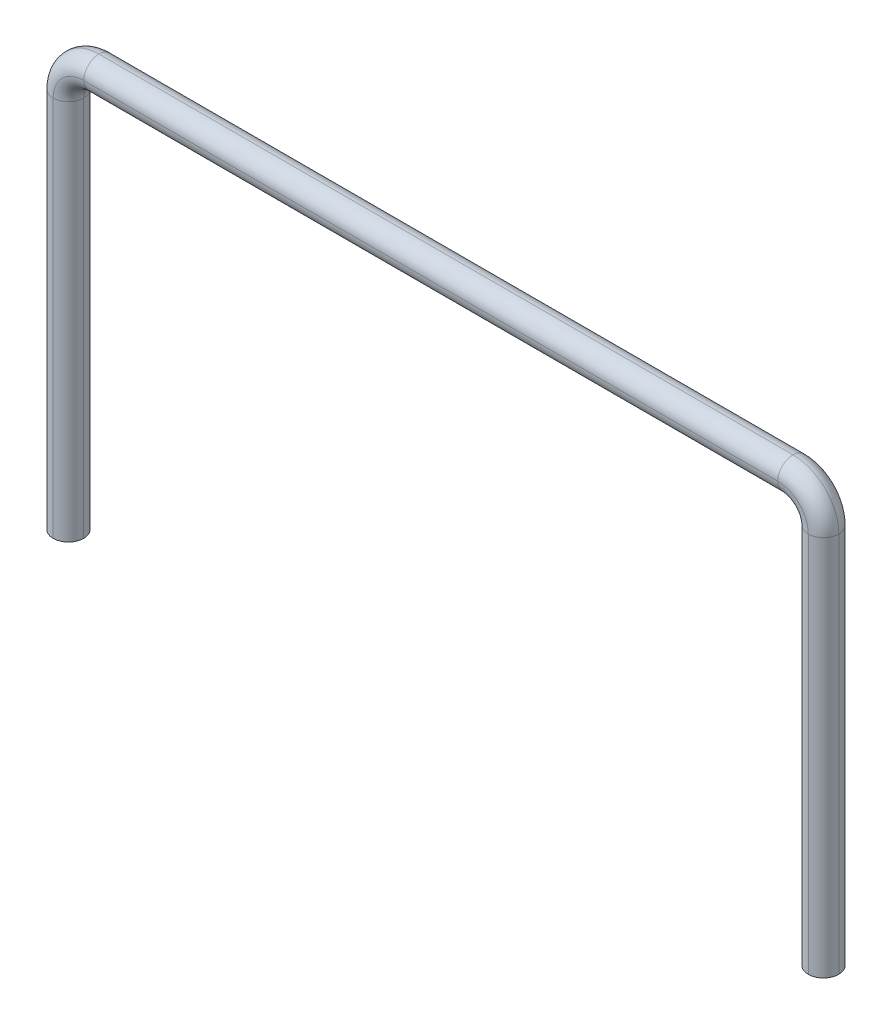
ISO-10303-21;
HEADER;
FILE_DESCRIPTION(('STEP AP214'),'2;1');
FILE_NAME('part.step','',(''),(''),'','','');
FILE_SCHEMA(('AUTOMOTIVE_DESIGN { 1 0 10303 214 1 1 1 1 }'));
ENDSEC;
DATA;
#1=APPLICATION_CONTEXT('core data for automotive mechanical design processes');
#2=APPLICATION_PROTOCOL_DEFINITION('international standard','automotive_design',2000,#1);
#3=PRODUCT_CONTEXT('',#1,'mechanical');
#4=PRODUCT('Part','Part','',(#3));
#5=PRODUCT_RELATED_PRODUCT_CATEGORY('part','',(#4));
#6=PRODUCT_DEFINITION_FORMATION('','',#4);
#7=PRODUCT_DEFINITION_CONTEXT('part definition',#1,'design');
#8=PRODUCT_DEFINITION('design','',#6,#7);
#9=PRODUCT_DEFINITION_SHAPE('','',#8);
#10=(LENGTH_UNIT() NAMED_UNIT(*) SI_UNIT(.MILLI.,.METRE.));
#11=(NAMED_UNIT(*) PLANE_ANGLE_UNIT() SI_UNIT($,.RADIAN.));
#12=(NAMED_UNIT(*) SI_UNIT($,.STERADIAN.) SOLID_ANGLE_UNIT());
#13=UNCERTAINTY_MEASURE_WITH_UNIT(LENGTH_MEASURE(1.E-05),#10,'distance_accuracy_value','');
#14=(GEOMETRIC_REPRESENTATION_CONTEXT(3) GLOBAL_UNCERTAINTY_ASSIGNED_CONTEXT((#13)) GLOBAL_UNIT_ASSIGNED_CONTEXT((#10,
#11,#12)) REPRESENTATION_CONTEXT('',''));
#15=CARTESIAN_POINT('',(0.,0.,0.));
#16=DIRECTION('',(0.,0.,1.));
#17=DIRECTION('',(1.,0.,0.));
#18=AXIS2_PLACEMENT_3D('',#15,#16,#17);
#19=CARTESIAN_POINT('',(25.75,0.,2.));
#20=DIRECTION('',(0.,-1.,0.));
#21=DIRECTION('',(0.,0.,-0.999999999999999));
#22=AXIS2_PLACEMENT_3D('',#19,#20,#21);
#23=PLANE('',#22);
#24=CARTESIAN_POINT('',(24.75,0.,1.00000000000017));
#25=DIRECTION('',(0.,-1.,0.));
#26=DIRECTION('',(0.,0.,-0.999999999999999));
#27=AXIS2_PLACEMENT_3D('',#24,#25,#26);
#28=CIRCLE('',#27,1.);
#29=CARTESIAN_POINT('',(23.75,0.,1.00000000000017));
#30=VERTEX_POINT('',#29);
#31=CARTESIAN_POINT('',(24.75,0.,1.66533453693773E-13));
#32=VERTEX_POINT('',#31);
#33=EDGE_CURVE('E239',#30,#32,#28,.T.);
#34=ORIENTED_EDGE('',*,*,#33,.T.);
#35=CARTESIAN_POINT('',(24.75,0.,1.00000000000017));
#36=DIRECTION('',(0.,-1.,0.));
#37=DIRECTION('',(0.,0.,-0.999999999999999));
#38=AXIS2_PLACEMENT_3D('',#35,#36,#37);
#39=CIRCLE('',#38,1.);
#40=CARTESIAN_POINT('',(25.75,0.,1.));
#41=VERTEX_POINT('',#40);
#42=EDGE_CURVE('E152',#32,#41,#39,.T.);
#43=ORIENTED_EDGE('',*,*,#42,.T.);
#44=CARTESIAN_POINT('',(24.75,0.,1.00000000000017));
#45=DIRECTION('',(0.,-1.,0.));
#46=DIRECTION('',(0.,0.,-0.999999999999999));
#47=AXIS2_PLACEMENT_3D('',#44,#45,#46);
#48=CIRCLE('',#47,1.);
#49=CARTESIAN_POINT('',(24.75,0.,2.00000000000017));
#50=VERTEX_POINT('',#49);
#51=EDGE_CURVE('E237',#41,#50,#48,.T.);
#52=ORIENTED_EDGE('',*,*,#51,.T.);
#53=CARTESIAN_POINT('',(24.75,0.,1.00000000000017));
#54=DIRECTION('',(0.,-1.,0.));
#55=DIRECTION('',(0.,0.,-0.999999999999999));
#56=AXIS2_PLACEMENT_3D('',#53,#54,#55);
#57=CIRCLE('',#56,1.);
#58=EDGE_CURVE('E235',#50,#30,#57,.T.);
#59=ORIENTED_EDGE('',*,*,#58,.T.);
#60=EDGE_LOOP('',(#34,#43,#52,#59));
#61=FACE_BOUND('',#60,.T.);
#62=ADVANCED_FACE('F28',(#61),#23,.T.);
#63=CARTESIAN_POINT('',(-23.75,0.,2.));
#64=DIRECTION('',(0.,-1.,0.));
#65=DIRECTION('',(0.,0.,-0.999999999999999));
#66=AXIS2_PLACEMENT_3D('',#63,#64,#65);
#67=PLANE('',#66);
#68=CARTESIAN_POINT('',(-24.75,0.,1.));
#69=DIRECTION('',(0.,-1.,0.));
#70=DIRECTION('',(0.,0.,-0.999999999999999));
#71=AXIS2_PLACEMENT_3D('',#68,#69,#70);
#72=CIRCLE('',#71,1.);
#73=CARTESIAN_POINT('',(-24.75,0.,2.));
#74=VERTEX_POINT('',#73);
#75=CARTESIAN_POINT('',(-25.75,0.,1.));
#76=VERTEX_POINT('',#75);
#77=EDGE_CURVE('E41',#74,#76,#72,.T.);
#78=ORIENTED_EDGE('',*,*,#77,.T.);
#79=CARTESIAN_POINT('',(-24.75,0.,1.));
#80=DIRECTION('',(0.,-1.,0.));
#81=DIRECTION('',(0.,0.,-0.999999999999999));
#82=AXIS2_PLACEMENT_3D('',#79,#80,#81);
#83=CIRCLE('',#82,1.);
#84=CARTESIAN_POINT('',(-24.75,0.,0.));
#85=VERTEX_POINT('',#84);
#86=EDGE_CURVE('E11',#76,#85,#83,.T.);
#87=ORIENTED_EDGE('',*,*,#86,.T.);
#88=CARTESIAN_POINT('',(-24.75,0.,1.));
#89=DIRECTION('',(0.,-1.,0.));
#90=DIRECTION('',(0.,0.,-0.999999999999999));
#91=AXIS2_PLACEMENT_3D('',#88,#89,#90);
#92=CIRCLE('',#91,1.);
#93=CARTESIAN_POINT('',(-23.75,0.,1.00000000000017));
#94=VERTEX_POINT('',#93);
#95=EDGE_CURVE('E35',#85,#94,#92,.T.);
#96=ORIENTED_EDGE('',*,*,#95,.T.);
#97=CARTESIAN_POINT('',(-24.75,0.,1.));
#98=DIRECTION('',(0.,-1.,0.));
#99=DIRECTION('',(0.,0.,-0.999999999999999));
#100=AXIS2_PLACEMENT_3D('',#97,#98,#99);
#101=CIRCLE('',#100,1.);
#102=EDGE_CURVE('E46',#94,#74,#101,.T.);
#103=ORIENTED_EDGE('',*,*,#102,.T.);
#104=EDGE_LOOP('',(#78,#87,#96,#103));
#105=FACE_BOUND('',#104,.T.);
#106=ADVANCED_FACE('F244',(#105),#67,.T.);
#107=CARTESIAN_POINT('',(-24.75,25.,1.));
#108=DIRECTION('',(0.,1.,0.));
#109=DIRECTION('',(0.,0.,0.999999999999999));
#110=AXIS2_PLACEMENT_3D('',#107,#108,#109);
#111=CYLINDRICAL_SURFACE('',#110,1.);
#112=DIRECTION('',(0.,1.,0.));
#113=VECTOR('',#112,1.);
#114=CARTESIAN_POINT('',(-24.75,25.,2.));
#115=LINE('',#114,#113);
#116=CARTESIAN_POINT('',(-24.75,25.,2.));
#117=VERTEX_POINT('',#116);
#118=EDGE_CURVE('E233',#74,#117,#115,.T.);
#119=ORIENTED_EDGE('',*,*,#118,.F.);
#120=ORIENTED_EDGE('',*,*,#102,.F.);
#121=DIRECTION('',(0.,1.,0.));
#122=VECTOR('',#121,1.);
#123=CARTESIAN_POINT('',(-23.75,0.,1.00000000000017));
#124=LINE('',#123,#122);
#125=CARTESIAN_POINT('',(-23.75,25.,1.00000000000017));
#126=VERTEX_POINT('',#125);
#127=EDGE_CURVE('E230',#126,#94,#124,.F.);
#128=ORIENTED_EDGE('',*,*,#127,.F.);
#129=CARTESIAN_POINT('',(-24.75,25.,1.));
#130=DIRECTION('',(0.,1.,0.));
#131=DIRECTION('',(0.,0.,0.999999999999999));
#132=AXIS2_PLACEMENT_3D('',#129,#130,#131);
#133=CIRCLE('',#132,1.);
#134=EDGE_CURVE('E227',#117,#126,#133,.T.);
#135=ORIENTED_EDGE('',*,*,#134,.F.);
#136=EDGE_LOOP('',(#119,#120,#128,#135));
#137=FACE_BOUND('',#136,.T.);
#138=ADVANCED_FACE('F248',(#137),#111,.T.);
#139=CARTESIAN_POINT('',(-24.75,0.,1.));
#140=DIRECTION('',(0.,-1.,0.));
#141=DIRECTION('',(0.,0.,-0.999999999999999));
#142=AXIS2_PLACEMENT_3D('',#139,#140,#141);
#143=CYLINDRICAL_SURFACE('',#142,1.);
#144=ORIENTED_EDGE('',*,*,#77,.F.);
#145=ORIENTED_EDGE('',*,*,#118,.T.);
#146=CARTESIAN_POINT('',(-24.75,25.,1.));
#147=DIRECTION('',(0.,1.,0.));
#148=DIRECTION('',(0.,0.,0.999999999999999));
#149=AXIS2_PLACEMENT_3D('',#146,#147,#148);
#150=CIRCLE('',#149,1.);
#151=CARTESIAN_POINT('',(-25.75,25.,1.));
#152=VERTEX_POINT('',#151);
#153=EDGE_CURVE('E222',#152,#117,#150,.T.);
#154=ORIENTED_EDGE('',*,*,#153,.F.);
#155=DIRECTION('',(0.,1.,0.));
#156=VECTOR('',#155,1.);
#157=CARTESIAN_POINT('',(-25.75,25.,1.));
#158=LINE('',#157,#156);
#159=EDGE_CURVE('E219',#76,#152,#158,.T.);
#160=ORIENTED_EDGE('',*,*,#159,.F.);
#161=EDGE_LOOP('',(#144,#145,#154,#160));
#162=FACE_BOUND('',#161,.T.);
#163=ADVANCED_FACE('F277',(#162),#143,.T.);
#164=CARTESIAN_POINT('',(-24.75,0.,1.));
#165=DIRECTION('',(0.,-1.,0.));
#166=DIRECTION('',(0.,0.,-0.999999999999999));
#167=AXIS2_PLACEMENT_3D('',#164,#165,#166);
#168=CYLINDRICAL_SURFACE('',#167,1.);
#169=ORIENTED_EDGE('',*,*,#127,.T.);
#170=ORIENTED_EDGE('',*,*,#95,.F.);
#171=DIRECTION('',(0.,1.,0.));
#172=VECTOR('',#171,1.);
#173=CARTESIAN_POINT('',(-24.75,0.,0.));
#174=LINE('',#173,#172);
#175=CARTESIAN_POINT('',(-24.75,25.,0.));
#176=VERTEX_POINT('',#175);
#177=EDGE_CURVE('E217',#176,#85,#174,.F.);
#178=ORIENTED_EDGE('',*,*,#177,.F.);
#179=CARTESIAN_POINT('',(-24.75,25.,1.));
#180=DIRECTION('',(0.,1.,0.));
#181=DIRECTION('',(0.,0.,0.999999999999999));
#182=AXIS2_PLACEMENT_3D('',#179,#180,#181);
#183=CIRCLE('',#182,1.);
#184=EDGE_CURVE('E214',#126,#176,#183,.T.);
#185=ORIENTED_EDGE('',*,*,#184,.F.);
#186=EDGE_LOOP('',(#169,#170,#178,#185));
#187=FACE_BOUND('',#186,.T.);
#188=ADVANCED_FACE('F251',(#187),#168,.T.);
#189=CARTESIAN_POINT('',(-22.7499999999999,25.,1.00000000000017));
#190=DIRECTION('',(0.,0.,-0.999999999999999));
#191=DIRECTION('',(-0.999999999999999,0.,0.));
#192=AXIS2_PLACEMENT_3D('',#189,#190,#191);
#193=TOROIDAL_SURFACE('',#192,2.,1.);
#194=CARTESIAN_POINT('',(-22.75,25.,2.));
#195=DIRECTION('',(0.,0.,-0.999999999999999));
#196=DIRECTION('',(-0.999999999999999,0.,0.));
#197=AXIS2_PLACEMENT_3D('',#194,#195,#196);
#198=CIRCLE('',#197,2.);
#199=CARTESIAN_POINT('',(-22.75,27.,2.));
#200=VERTEX_POINT('',#199);
#201=EDGE_CURVE('E225',#117,#200,#198,.T.);
#202=ORIENTED_EDGE('',*,*,#201,.F.);
#203=ORIENTED_EDGE('',*,*,#134,.T.);
#204=CARTESIAN_POINT('',(-22.7499999999999,25.,1.00000000000017));
#205=DIRECTION('',(0.,0.,-0.999999999999999));
#206=DIRECTION('',(-0.999999999999999,0.,0.));
#207=AXIS2_PLACEMENT_3D('',#204,#205,#206);
#208=CIRCLE('',#207,1.);
#209=CARTESIAN_POINT('',(-22.7499999999999,26.,1.00000000000017));
#210=VERTEX_POINT('',#209);
#211=EDGE_CURVE('E211',#210,#126,#208,.F.);
#212=ORIENTED_EDGE('',*,*,#211,.F.);
#213=CARTESIAN_POINT('',(-22.7499999999999,27.,1.00000000000017));
#214=DIRECTION('',(0.999999999999999,0.,0.));
#215=DIRECTION('',(0.,0.,-0.999999999999999));
#216=AXIS2_PLACEMENT_3D('',#213,#214,#215);
#217=CIRCLE('',#216,1.);
#218=EDGE_CURVE('E208',#200,#210,#217,.T.);
#219=ORIENTED_EDGE('',*,*,#218,.F.);
#220=EDGE_LOOP('',(#202,#203,#212,#219));
#221=FACE_BOUND('',#220,.T.);
#222=ADVANCED_FACE('F259',(#221),#193,.T.);
#223=CARTESIAN_POINT('',(-22.7499999999999,25.,1.00000000000017));
#224=DIRECTION('',(0.,0.,-0.999999999999999));
#225=DIRECTION('',(-0.999999999999999,0.,0.));
#226=AXIS2_PLACEMENT_3D('',#223,#224,#225);
#227=TOROIDAL_SURFACE('',#226,2.,1.);
#228=ORIENTED_EDGE('',*,*,#153,.T.);
#229=ORIENTED_EDGE('',*,*,#201,.T.);
#230=CARTESIAN_POINT('',(-22.7499999999999,27.,1.00000000000017));
#231=DIRECTION('',(0.999999999999999,0.,0.));
#232=DIRECTION('',(0.,0.,-0.999999999999999));
#233=AXIS2_PLACEMENT_3D('',#230,#231,#232);
#234=CIRCLE('',#233,1.);
#235=CARTESIAN_POINT('',(-22.7499999999999,28.,1.00000000000017));
#236=VERTEX_POINT('',#235);
#237=EDGE_CURVE('E203',#236,#200,#234,.T.);
#238=ORIENTED_EDGE('',*,*,#237,.F.);
#239=CARTESIAN_POINT('',(-22.7499999999999,25.,1.00000000000017));
#240=DIRECTION('',(0.,0.,-0.999999999999999));
#241=DIRECTION('',(-0.999999999999999,0.,0.));
#242=AXIS2_PLACEMENT_3D('',#239,#240,#241);
#243=CIRCLE('',#242,3.);
#244=EDGE_CURVE('E200',#152,#236,#243,.T.);
#245=ORIENTED_EDGE('',*,*,#244,.F.);
#246=EDGE_LOOP('',(#228,#229,#238,#245));
#247=FACE_BOUND('',#246,.T.);
#248=ADVANCED_FACE('F270',(#247),#227,.T.);
#249=CARTESIAN_POINT('',(-24.75,25.,1.));
#250=DIRECTION('',(0.,1.,0.));
#251=DIRECTION('',(0.,0.,0.999999999999999));
#252=AXIS2_PLACEMENT_3D('',#249,#250,#251);
#253=CYLINDRICAL_SURFACE('',#252,1.);
#254=ORIENTED_EDGE('',*,*,#86,.F.);
#255=ORIENTED_EDGE('',*,*,#159,.T.);
#256=CARTESIAN_POINT('',(-24.75,25.,1.));
#257=DIRECTION('',(0.,1.,0.));
#258=DIRECTION('',(0.,0.,0.999999999999999));
#259=AXIS2_PLACEMENT_3D('',#256,#257,#258);
#260=CIRCLE('',#259,1.);
#261=EDGE_CURVE('E197',#176,#152,#260,.T.);
#262=ORIENTED_EDGE('',*,*,#261,.F.);
#263=ORIENTED_EDGE('',*,*,#177,.T.);
#264=EDGE_LOOP('',(#254,#255,#262,#263));
#265=FACE_BOUND('',#264,.T.);
#266=ADVANCED_FACE('F275',(#265),#253,.T.);
#267=CARTESIAN_POINT('',(-22.7499999999999,25.,1.00000000000017));
#268=DIRECTION('',(0.,0.,-0.999999999999999));
#269=DIRECTION('',(-0.999999999999999,0.,0.));
#270=AXIS2_PLACEMENT_3D('',#267,#268,#269);
#271=TOROIDAL_SURFACE('',#270,2.,1.);
#272=ORIENTED_EDGE('',*,*,#211,.T.);
#273=ORIENTED_EDGE('',*,*,#184,.T.);
#274=CARTESIAN_POINT('',(-22.75,25.,0.));
#275=DIRECTION('',(0.,0.,-0.999999999999999));
#276=DIRECTION('',(-0.999999999999999,0.,0.));
#277=AXIS2_PLACEMENT_3D('',#274,#275,#276);
#278=CIRCLE('',#277,2.);
#279=CARTESIAN_POINT('',(-22.75,27.,0.));
#280=VERTEX_POINT('',#279);
#281=EDGE_CURVE('E194',#280,#176,#278,.F.);
#282=ORIENTED_EDGE('',*,*,#281,.F.);
#283=CARTESIAN_POINT('',(-22.7499999999999,27.,1.00000000000017));
#284=DIRECTION('',(0.999999999999999,0.,0.));
#285=DIRECTION('',(0.,0.,-0.999999999999999));
#286=AXIS2_PLACEMENT_3D('',#283,#284,#285);
#287=CIRCLE('',#286,1.);
#288=EDGE_CURVE('E191',#210,#280,#287,.T.);
#289=ORIENTED_EDGE('',*,*,#288,.F.);
#290=EDGE_LOOP('',(#272,#273,#282,#289));
#291=FACE_BOUND('',#290,.T.);
#292=ADVANCED_FACE('F255',(#291),#271,.T.);
#293=CARTESIAN_POINT('',(22.75,27.,1.00000000000017));
#294=DIRECTION('',(0.999999999999999,0.,0.));
#295=DIRECTION('',(0.,0.,-0.999999999999999));
#296=AXIS2_PLACEMENT_3D('',#293,#294,#295);
#297=CYLINDRICAL_SURFACE('',#296,1.);
#298=DIRECTION('',(0.999999999999999,0.,0.));
#299=VECTOR('',#298,1.);
#300=CARTESIAN_POINT('',(22.7500000000001,27.,2.));
#301=LINE('',#300,#299);
#302=CARTESIAN_POINT('',(22.7500000000001,27.,2.));
#303=VERTEX_POINT('',#302);
#304=EDGE_CURVE('E206',#200,#303,#301,.T.);
#305=ORIENTED_EDGE('',*,*,#304,.F.);
#306=ORIENTED_EDGE('',*,*,#218,.T.);
#307=DIRECTION('',(0.999999999999999,0.,0.));
#308=VECTOR('',#307,1.);
#309=CARTESIAN_POINT('',(-22.7499999999999,26.,1.00000000000017));
#310=LINE('',#309,#308);
#311=CARTESIAN_POINT('',(22.75,26.,1.00000000000017));
#312=VERTEX_POINT('',#311);
#313=EDGE_CURVE('E188',#312,#210,#310,.F.);
#314=ORIENTED_EDGE('',*,*,#313,.F.);
#315=CARTESIAN_POINT('',(22.75,27.,1.00000000000017));
#316=DIRECTION('',(0.999999999999999,0.,0.));
#317=DIRECTION('',(0.,0.,-0.999999999999999));
#318=AXIS2_PLACEMENT_3D('',#315,#316,#317);
#319=CIRCLE('',#318,1.);
#320=EDGE_CURVE('E185',#303,#312,#319,.T.);
#321=ORIENTED_EDGE('',*,*,#320,.F.);
#322=EDGE_LOOP('',(#305,#306,#314,#321));
#323=FACE_BOUND('',#322,.T.);
#324=ADVANCED_FACE('F262',(#323),#297,.T.);
#325=CARTESIAN_POINT('',(-22.7499999999999,27.,1.00000000000017));
#326=DIRECTION('',(-0.999999999999999,0.,0.));
#327=DIRECTION('',(0.,0.,0.999999999999999));
#328=AXIS2_PLACEMENT_3D('',#325,#326,#327);
#329=CYLINDRICAL_SURFACE('',#328,1.);
#330=ORIENTED_EDGE('',*,*,#237,.T.);
#331=ORIENTED_EDGE('',*,*,#304,.T.);
#332=CARTESIAN_POINT('',(22.75,27.,1.00000000000017));
#333=DIRECTION('',(0.999999999999999,0.,0.));
#334=DIRECTION('',(0.,0.,-0.999999999999999));
#335=AXIS2_PLACEMENT_3D('',#332,#333,#334);
#336=CIRCLE('',#335,1.);
#337=CARTESIAN_POINT('',(22.75,28.,1.00000000000017));
#338=VERTEX_POINT('',#337);
#339=EDGE_CURVE('E180',#338,#303,#336,.T.);
#340=ORIENTED_EDGE('',*,*,#339,.F.);
#341=DIRECTION('',(0.999999999999999,0.,0.));
#342=VECTOR('',#341,1.);
#343=CARTESIAN_POINT('',(22.75,28.,1.00000000000017));
#344=LINE('',#343,#342);
#345=EDGE_CURVE('E177',#236,#338,#344,.T.);
#346=ORIENTED_EDGE('',*,*,#345,.F.);
#347=EDGE_LOOP('',(#330,#331,#340,#346));
#348=FACE_BOUND('',#347,.T.);
#349=ADVANCED_FACE('F267',(#348),#329,.T.);
#350=CARTESIAN_POINT('',(-22.7499999999999,25.,1.00000000000017));
#351=DIRECTION('',(0.,0.,-0.999999999999999));
#352=DIRECTION('',(-0.999999999999999,0.,0.));
#353=AXIS2_PLACEMENT_3D('',#350,#351,#352);
#354=TOROIDAL_SURFACE('',#353,2.,1.);
#355=ORIENTED_EDGE('',*,*,#261,.T.);
#356=ORIENTED_EDGE('',*,*,#244,.T.);
#357=CARTESIAN_POINT('',(-22.7499999999999,27.,1.00000000000017));
#358=DIRECTION('',(0.999999999999999,0.,0.));
#359=DIRECTION('',(0.,0.,-0.999999999999999));
#360=AXIS2_PLACEMENT_3D('',#357,#358,#359);
#361=CIRCLE('',#360,1.);
#362=EDGE_CURVE('E174',#280,#236,#361,.T.);
#363=ORIENTED_EDGE('',*,*,#362,.F.);
#364=ORIENTED_EDGE('',*,*,#281,.T.);
#365=EDGE_LOOP('',(#355,#356,#363,#364));
#366=FACE_BOUND('',#365,.T.);
#367=ADVANCED_FACE('F273',(#366),#354,.T.);
#368=CARTESIAN_POINT('',(-22.7499999999999,27.,1.00000000000017));
#369=DIRECTION('',(-0.999999999999999,0.,0.));
#370=DIRECTION('',(0.,0.,0.999999999999999));
#371=AXIS2_PLACEMENT_3D('',#368,#369,#370);
#372=CYLINDRICAL_SURFACE('',#371,1.);
#373=ORIENTED_EDGE('',*,*,#313,.T.);
#374=ORIENTED_EDGE('',*,*,#288,.T.);
#375=DIRECTION('',(0.999999999999999,0.,0.));
#376=VECTOR('',#375,1.);
#377=CARTESIAN_POINT('',(-22.75,27.,0.));
#378=LINE('',#377,#376);
#379=CARTESIAN_POINT('',(22.7500000000001,27.,0.));
#380=VERTEX_POINT('',#379);
#381=EDGE_CURVE('E171',#380,#280,#378,.F.);
#382=ORIENTED_EDGE('',*,*,#381,.F.);
#383=CARTESIAN_POINT('',(22.75,27.,1.00000000000017));
#384=DIRECTION('',(0.999999999999999,0.,0.));
#385=DIRECTION('',(0.,0.,-0.999999999999999));
#386=AXIS2_PLACEMENT_3D('',#383,#384,#385);
#387=CIRCLE('',#386,1.);
#388=EDGE_CURVE('E123',#312,#380,#387,.T.);
#389=ORIENTED_EDGE('',*,*,#388,.F.);
#390=EDGE_LOOP('',(#373,#374,#382,#389));
#391=FACE_BOUND('',#390,.T.);
#392=ADVANCED_FACE('F300',(#391),#372,.T.);
#393=CARTESIAN_POINT('',(22.75,25.,1.00000000000017));
#394=DIRECTION('',(0.,0.,-0.999999999999999));
#395=DIRECTION('',(-0.999999999999999,0.,0.));
#396=AXIS2_PLACEMENT_3D('',#393,#394,#395);
#397=TOROIDAL_SURFACE('',#396,2.,1.);
#398=CARTESIAN_POINT('',(22.7500000000001,25.,2.));
#399=DIRECTION('',(0.,0.,-0.999999999999999));
#400=DIRECTION('',(-0.999999999999999,0.,0.));
#401=AXIS2_PLACEMENT_3D('',#398,#399,#400);
#402=CIRCLE('',#401,2.);
#403=CARTESIAN_POINT('',(24.75,25.,2.00000000000017));
#404=VERTEX_POINT('',#403);
#405=EDGE_CURVE('E183',#303,#404,#402,.T.);
#406=ORIENTED_EDGE('',*,*,#405,.F.);
#407=ORIENTED_EDGE('',*,*,#320,.T.);
#408=CARTESIAN_POINT('',(22.75,25.,1.00000000000017));
#409=DIRECTION('',(0.,0.,-0.999999999999999));
#410=DIRECTION('',(-0.999999999999999,0.,0.));
#411=AXIS2_PLACEMENT_3D('',#408,#409,#410);
#412=CIRCLE('',#411,1.);
#413=CARTESIAN_POINT('',(23.75,25.,1.00000000000017));
#414=VERTEX_POINT('',#413);
#415=EDGE_CURVE('E168',#414,#312,#412,.F.);
#416=ORIENTED_EDGE('',*,*,#415,.F.);
#417=CARTESIAN_POINT('',(24.75,25.,1.00000000000017));
#418=DIRECTION('',(0.,-1.,0.));
#419=DIRECTION('',(0.,0.,-0.999999999999999));
#420=AXIS2_PLACEMENT_3D('',#417,#418,#419);
#421=CIRCLE('',#420,1.);
#422=EDGE_CURVE('E165',#404,#414,#421,.T.);
#423=ORIENTED_EDGE('',*,*,#422,.F.);
#424=EDGE_LOOP('',(#406,#407,#416,#423));
#425=FACE_BOUND('',#424,.T.);
#426=ADVANCED_FACE('F298',(#425),#397,.T.);
#427=CARTESIAN_POINT('',(22.75,25.,1.00000000000017));
#428=DIRECTION('',(0.,0.,-0.999999999999999));
#429=DIRECTION('',(-0.999999999999999,0.,0.));
#430=AXIS2_PLACEMENT_3D('',#427,#428,#429);
#431=TOROIDAL_SURFACE('',#430,2.,1.);
#432=ORIENTED_EDGE('',*,*,#339,.T.);
#433=ORIENTED_EDGE('',*,*,#405,.T.);
#434=CARTESIAN_POINT('',(24.75,25.,1.00000000000017));
#435=DIRECTION('',(0.,-1.,0.));
#436=DIRECTION('',(0.,0.,-0.999999999999999));
#437=AXIS2_PLACEMENT_3D('',#434,#435,#436);
#438=CIRCLE('',#437,1.);
#439=CARTESIAN_POINT('',(25.75,25.,1.));
#440=VERTEX_POINT('',#439);
#441=EDGE_CURVE('E159',#440,#404,#438,.T.);
#442=ORIENTED_EDGE('',*,*,#441,.F.);
#443=CARTESIAN_POINT('',(22.75,25.,1.00000000000017));
#444=DIRECTION('',(0.,0.,-0.999999999999999));
#445=DIRECTION('',(-0.999999999999999,0.,0.));
#446=AXIS2_PLACEMENT_3D('',#443,#444,#445);
#447=CIRCLE('',#446,3.);
#448=EDGE_CURVE('E145',#338,#440,#447,.T.);
#449=ORIENTED_EDGE('',*,*,#448,.F.);
#450=EDGE_LOOP('',(#432,#433,#442,#449));
#451=FACE_BOUND('',#450,.T.);
#452=ADVANCED_FACE('F304',(#451),#431,.T.);
#453=CARTESIAN_POINT('',(22.75,27.,1.00000000000017));
#454=DIRECTION('',(0.999999999999999,0.,0.));
#455=DIRECTION('',(0.,0.,-0.999999999999999));
#456=AXIS2_PLACEMENT_3D('',#453,#454,#455);
#457=CYLINDRICAL_SURFACE('',#456,1.);
#458=ORIENTED_EDGE('',*,*,#362,.T.);
#459=ORIENTED_EDGE('',*,*,#345,.T.);
#460=CARTESIAN_POINT('',(22.75,27.,1.00000000000017));
#461=DIRECTION('',(0.999999999999999,0.,0.));
#462=DIRECTION('',(0.,0.,-0.999999999999999));
#463=AXIS2_PLACEMENT_3D('',#460,#461,#462);
#464=CIRCLE('',#463,1.);
#465=EDGE_CURVE('E128',#380,#338,#464,.T.);
#466=ORIENTED_EDGE('',*,*,#465,.F.);
#467=ORIENTED_EDGE('',*,*,#381,.T.);
#468=EDGE_LOOP('',(#458,#459,#466,#467));
#469=FACE_BOUND('',#468,.T.);
#470=ADVANCED_FACE('F302',(#469),#457,.T.);
#471=CARTESIAN_POINT('',(22.75,25.,1.00000000000017));
#472=DIRECTION('',(0.,0.,-0.999999999999999));
#473=DIRECTION('',(-0.999999999999999,0.,0.));
#474=AXIS2_PLACEMENT_3D('',#471,#472,#473);
#475=TOROIDAL_SURFACE('',#474,2.,1.);
#476=ORIENTED_EDGE('',*,*,#415,.T.);
#477=ORIENTED_EDGE('',*,*,#388,.T.);
#478=CARTESIAN_POINT('',(22.7500000000001,25.,0.));
#479=DIRECTION('',(0.,0.,-0.999999999999999));
#480=DIRECTION('',(-0.999999999999999,0.,0.));
#481=AXIS2_PLACEMENT_3D('',#478,#479,#480);
#482=CIRCLE('',#481,2.);
#483=CARTESIAN_POINT('',(24.75,25.,1.66533453693773E-13));
#484=VERTEX_POINT('',#483);
#485=EDGE_CURVE('E116',#484,#380,#482,.F.);
#486=ORIENTED_EDGE('',*,*,#485,.F.);
#487=CARTESIAN_POINT('',(24.75,25.,1.00000000000017));
#488=DIRECTION('',(0.,-1.,0.));
#489=DIRECTION('',(0.,0.,-0.999999999999999));
#490=AXIS2_PLACEMENT_3D('',#487,#488,#489);
#491=CIRCLE('',#490,1.);
#492=EDGE_CURVE('E120',#414,#484,#491,.T.);
#493=ORIENTED_EDGE('',*,*,#492,.F.);
#494=EDGE_LOOP('',(#476,#477,#486,#493));
#495=FACE_BOUND('',#494,.T.);
#496=ADVANCED_FACE('F119',(#495),#475,.T.);
#497=CARTESIAN_POINT('',(24.75,25.,1.00000000000017));
#498=DIRECTION('',(0.,-1.,0.));
#499=DIRECTION('',(0.,0.,-0.999999999999999));
#500=AXIS2_PLACEMENT_3D('',#497,#498,#499);
#501=CYLINDRICAL_SURFACE('',#500,1.);
#502=DIRECTION('',(0.,-1.,0.));
#503=VECTOR('',#502,1.);
#504=CARTESIAN_POINT('',(23.75,25.,1.00000000000017));
#505=LINE('',#504,#503);
#506=EDGE_CURVE('E138',#30,#414,#505,.F.);
#507=ORIENTED_EDGE('',*,*,#506,.F.);
#508=ORIENTED_EDGE('',*,*,#58,.F.);
#509=DIRECTION('',(0.,-1.,0.));
#510=VECTOR('',#509,1.);
#511=CARTESIAN_POINT('',(24.75,25.,2.00000000000017));
#512=LINE('',#511,#510);
#513=EDGE_CURVE('E162',#404,#50,#512,.T.);
#514=ORIENTED_EDGE('',*,*,#513,.F.);
#515=ORIENTED_EDGE('',*,*,#422,.T.);
#516=EDGE_LOOP('',(#507,#508,#514,#515));
#517=FACE_BOUND('',#516,.T.);
#518=ADVANCED_FACE('F295',(#517),#501,.T.);
#519=CARTESIAN_POINT('',(24.75,25.,1.00000000000017));
#520=DIRECTION('',(0.,1.,0.));
#521=DIRECTION('',(0.,0.,0.999999999999999));
#522=AXIS2_PLACEMENT_3D('',#519,#520,#521);
#523=CYLINDRICAL_SURFACE('',#522,1.);
#524=ORIENTED_EDGE('',*,*,#513,.T.);
#525=ORIENTED_EDGE('',*,*,#51,.F.);
#526=DIRECTION('',(0.,-1.,0.));
#527=VECTOR('',#526,1.);
#528=CARTESIAN_POINT('',(25.75,0.,1.));
#529=LINE('',#528,#527);
#530=EDGE_CURVE('E148',#440,#41,#529,.T.);
#531=ORIENTED_EDGE('',*,*,#530,.F.);
#532=ORIENTED_EDGE('',*,*,#441,.T.);
#533=EDGE_LOOP('',(#524,#525,#531,#532));
#534=FACE_BOUND('',#533,.T.);
#535=ADVANCED_FACE('F306',(#534),#523,.T.);
#536=CARTESIAN_POINT('',(22.75,25.,1.00000000000017));
#537=DIRECTION('',(0.,0.,-0.999999999999999));
#538=DIRECTION('',(-0.999999999999999,0.,0.));
#539=AXIS2_PLACEMENT_3D('',#536,#537,#538);
#540=TOROIDAL_SURFACE('',#539,2.,1.);
#541=ORIENTED_EDGE('',*,*,#465,.T.);
#542=ORIENTED_EDGE('',*,*,#448,.T.);
#543=CARTESIAN_POINT('',(24.75,25.,1.00000000000017));
#544=DIRECTION('',(0.,-1.,0.));
#545=DIRECTION('',(0.,0.,-0.999999999999999));
#546=AXIS2_PLACEMENT_3D('',#543,#544,#545);
#547=CIRCLE('',#546,1.);
#548=EDGE_CURVE('E142',#484,#440,#547,.T.);
#549=ORIENTED_EDGE('',*,*,#548,.F.);
#550=ORIENTED_EDGE('',*,*,#485,.T.);
#551=EDGE_LOOP('',(#541,#542,#549,#550));
#552=FACE_BOUND('',#551,.T.);
#553=ADVANCED_FACE('F143',(#552),#540,.T.);
#554=CARTESIAN_POINT('',(24.75,25.,1.00000000000017));
#555=DIRECTION('',(0.,1.,0.));
#556=DIRECTION('',(0.,0.,0.999999999999999));
#557=AXIS2_PLACEMENT_3D('',#554,#555,#556);
#558=CYLINDRICAL_SURFACE('',#557,1.);
#559=ORIENTED_EDGE('',*,*,#506,.T.);
#560=ORIENTED_EDGE('',*,*,#492,.T.);
#561=DIRECTION('',(0.,-1.,0.));
#562=VECTOR('',#561,1.);
#563=CARTESIAN_POINT('',(24.75,25.,1.66533453693773E-13));
#564=LINE('',#563,#562);
#565=EDGE_CURVE('E135',#32,#484,#564,.F.);
#566=ORIENTED_EDGE('',*,*,#565,.F.);
#567=ORIENTED_EDGE('',*,*,#33,.F.);
#568=EDGE_LOOP('',(#559,#560,#566,#567));
#569=FACE_BOUND('',#568,.T.);
#570=ADVANCED_FACE('F132',(#569),#558,.T.);
#571=CARTESIAN_POINT('',(24.75,25.,1.00000000000017));
#572=DIRECTION('',(0.,-1.,0.));
#573=DIRECTION('',(0.,0.,-0.999999999999999));
#574=AXIS2_PLACEMENT_3D('',#571,#572,#573);
#575=CYLINDRICAL_SURFACE('',#574,1.);
#576=ORIENTED_EDGE('',*,*,#548,.T.);
#577=ORIENTED_EDGE('',*,*,#530,.T.);
#578=ORIENTED_EDGE('',*,*,#42,.F.);
#579=ORIENTED_EDGE('',*,*,#565,.T.);
#580=EDGE_LOOP('',(#576,#577,#578,#579));
#581=FACE_BOUND('',#580,.T.);
#582=ADVANCED_FACE('F150',(#581),#575,.T.);
#583=CLOSED_SHELL('',(#62,#106,#138,#163,#188,#222,#248,#266,#292,#324,#349,#367,#392,#426,#452,
#470,#496,#518,#535,#553,#570,#582));
#584=MANIFOLD_SOLID_BREP('B2',#583);
#585=ADVANCED_BREP_SHAPE_REPRESENTATION('',(#18,#584),#14);
#586=SHAPE_DEFINITION_REPRESENTATION(#9,#585);
ENDSEC;
END-ISO-10303-21;
